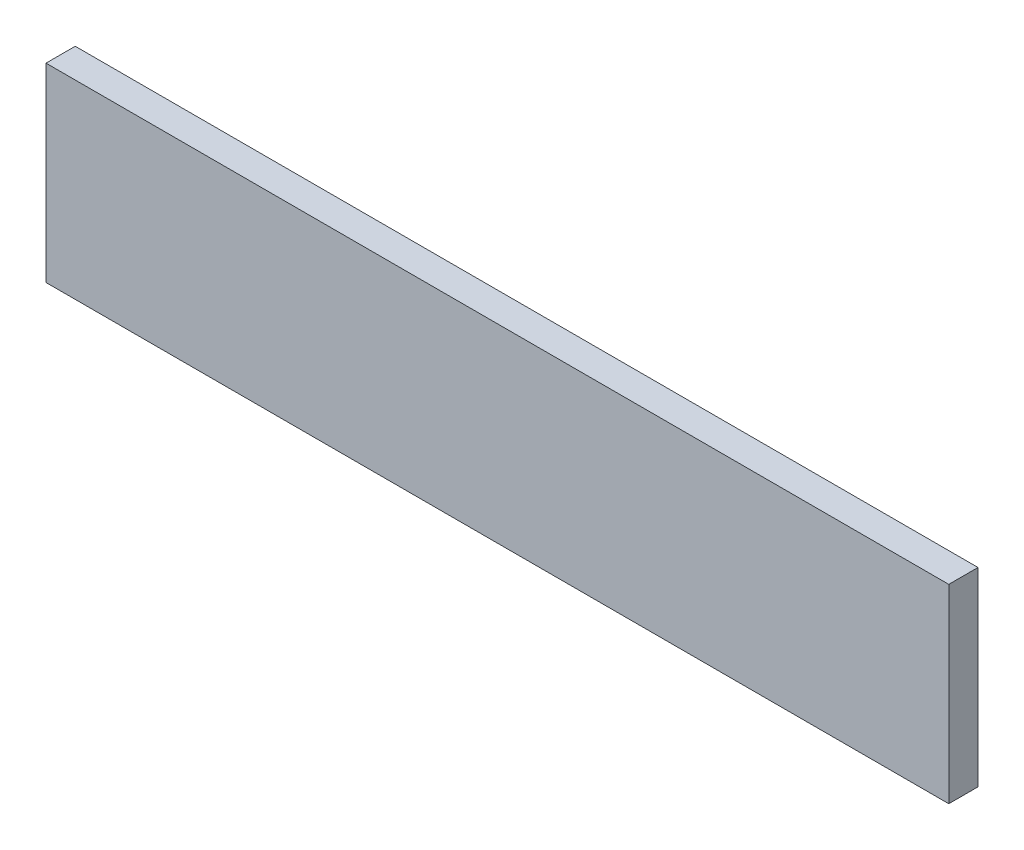
ISO-10303-21;
HEADER;
FILE_DESCRIPTION(('STEP AP214'),'2;1');
FILE_NAME('part.step','',(''),(''),'','','');
FILE_SCHEMA(('AUTOMOTIVE_DESIGN { 1 0 10303 214 1 1 1 1 }'));
ENDSEC;
DATA;
#1=APPLICATION_CONTEXT('core data for automotive mechanical design processes');
#2=APPLICATION_PROTOCOL_DEFINITION('international standard','automotive_design',2000,#1);
#3=PRODUCT_CONTEXT('',#1,'mechanical');
#4=PRODUCT('Part','Part','',(#3));
#5=PRODUCT_RELATED_PRODUCT_CATEGORY('part','',(#4));
#6=PRODUCT_DEFINITION_FORMATION('','',#4);
#7=PRODUCT_DEFINITION_CONTEXT('part definition',#1,'design');
#8=PRODUCT_DEFINITION('design','',#6,#7);
#9=PRODUCT_DEFINITION_SHAPE('','',#8);
#10=(LENGTH_UNIT() NAMED_UNIT(*) SI_UNIT(.MILLI.,.METRE.));
#11=(NAMED_UNIT(*) PLANE_ANGLE_UNIT() SI_UNIT($,.RADIAN.));
#12=(NAMED_UNIT(*) SI_UNIT($,.STERADIAN.) SOLID_ANGLE_UNIT());
#13=UNCERTAINTY_MEASURE_WITH_UNIT(LENGTH_MEASURE(1.E-05),#10,'distance_accuracy_value','');
#14=(GEOMETRIC_REPRESENTATION_CONTEXT(3) GLOBAL_UNCERTAINTY_ASSIGNED_CONTEXT((#13)) GLOBAL_UNIT_ASSIGNED_CONTEXT((#10,
#11,#12)) REPRESENTATION_CONTEXT('',''));
#15=CARTESIAN_POINT('',(0.,0.,0.));
#16=DIRECTION('',(0.,0.,1.));
#17=DIRECTION('',(1.,0.,0.));
#18=AXIS2_PLACEMENT_3D('',#15,#16,#17);
#19=CARTESIAN_POINT('',(196.1080533,41.275,12.7));
#20=DIRECTION('',(-1.,0.,0.));
#21=DIRECTION('',(0.,-1.,0.));
#22=AXIS2_PLACEMENT_3D('',#19,#20,#21);
#23=PLANE('',#22);
#24=DIRECTION('',(0.,1.,0.));
#25=VECTOR('',#24,1.);
#26=CARTESIAN_POINT('',(196.1080533,41.275,0.));
#27=LINE('',#26,#25);
#28=CARTESIAN_POINT('',(196.1080533,-41.275,0.));
#29=VERTEX_POINT('',#28);
#30=CARTESIAN_POINT('',(196.1080533,41.275,0.));
#31=VERTEX_POINT('',#30);
#32=EDGE_CURVE('E99',#29,#31,#27,.T.);
#33=ORIENTED_EDGE('',*,*,#32,.T.);
#34=DIRECTION('',(0.,0.,-1.));
#35=VECTOR('',#34,1.);
#36=CARTESIAN_POINT('',(196.1080533,41.275,12.7));
#37=LINE('',#36,#35);
#38=CARTESIAN_POINT('',(196.1080533,41.275,12.7));
#39=VERTEX_POINT('',#38);
#40=EDGE_CURVE('E11',#39,#31,#37,.T.);
#41=ORIENTED_EDGE('',*,*,#40,.F.);
#42=DIRECTION('',(0.,1.,0.));
#43=VECTOR('',#42,1.);
#44=CARTESIAN_POINT('',(196.1080533,41.275,12.7));
#45=LINE('',#44,#43);
#46=CARTESIAN_POINT('',(196.1080533,-41.275,12.7));
#47=VERTEX_POINT('',#46);
#48=EDGE_CURVE('E87',#47,#39,#45,.T.);
#49=ORIENTED_EDGE('',*,*,#48,.F.);
#50=DIRECTION('',(0.,0.,-1.));
#51=VECTOR('',#50,1.);
#52=CARTESIAN_POINT('',(196.1080533,-41.275,12.7));
#53=LINE('',#52,#51);
#54=EDGE_CURVE('E95',#47,#29,#53,.T.);
#55=ORIENTED_EDGE('',*,*,#54,.T.);
#56=EDGE_LOOP('',(#33,#41,#49,#55));
#57=FACE_BOUND('',#56,.T.);
#58=ADVANCED_FACE('F36',(#57),#23,.F.);
#59=CARTESIAN_POINT('',(-196.1080533,41.275,12.7));
#60=DIRECTION('',(0.,-1.,0.));
#61=DIRECTION('',(0.,0.,-1.));
#62=AXIS2_PLACEMENT_3D('',#59,#60,#61);
#63=PLANE('',#62);
#64=DIRECTION('',(-1.,0.,0.));
#65=VECTOR('',#64,1.);
#66=CARTESIAN_POINT('',(-196.1080533,41.275,0.));
#67=LINE('',#66,#65);
#68=CARTESIAN_POINT('',(-196.1080533,41.275,0.));
#69=VERTEX_POINT('',#68);
#70=EDGE_CURVE('E91',#31,#69,#67,.T.);
#71=ORIENTED_EDGE('',*,*,#70,.T.);
#72=DIRECTION('',(0.,0.,-1.));
#73=VECTOR('',#72,1.);
#74=CARTESIAN_POINT('',(-196.1080533,41.275,12.7));
#75=LINE('',#74,#73);
#76=CARTESIAN_POINT('',(-196.1080533,41.275,12.7));
#77=VERTEX_POINT('',#76);
#78=EDGE_CURVE('E44',#77,#69,#75,.T.);
#79=ORIENTED_EDGE('',*,*,#78,.F.);
#80=DIRECTION('',(-1.,0.,0.));
#81=VECTOR('',#80,1.);
#82=CARTESIAN_POINT('',(-196.1080533,41.275,12.7));
#83=LINE('',#82,#81);
#84=EDGE_CURVE('E82',#39,#77,#83,.T.);
#85=ORIENTED_EDGE('',*,*,#84,.F.);
#86=ORIENTED_EDGE('',*,*,#40,.T.);
#87=EDGE_LOOP('',(#71,#79,#85,#86));
#88=FACE_BOUND('',#87,.T.);
#89=ADVANCED_FACE('F90',(#88),#63,.F.);
#90=CARTESIAN_POINT('',(-196.1080533,41.275,12.7));
#91=DIRECTION('',(1.,0.,0.));
#92=DIRECTION('',(0.,0.,-1.));
#93=AXIS2_PLACEMENT_3D('',#90,#91,#92);
#94=PLANE('',#93);
#95=DIRECTION('',(0.,-1.,0.));
#96=VECTOR('',#95,1.);
#97=CARTESIAN_POINT('',(-196.1080533,41.275,0.));
#98=LINE('',#97,#96);
#99=CARTESIAN_POINT('',(-196.1080533,-41.275,0.));
#100=VERTEX_POINT('',#99);
#101=EDGE_CURVE('E69',#69,#100,#98,.T.);
#102=ORIENTED_EDGE('',*,*,#101,.T.);
#103=DIRECTION('',(0.,0.,-1.));
#104=VECTOR('',#103,1.);
#105=CARTESIAN_POINT('',(-196.1080533,-41.275,12.7));
#106=LINE('',#105,#104);
#107=CARTESIAN_POINT('',(-196.1080533,-41.275,12.7));
#108=VERTEX_POINT('',#107);
#109=EDGE_CURVE('E92',#108,#100,#106,.T.);
#110=ORIENTED_EDGE('',*,*,#109,.F.);
#111=DIRECTION('',(0.,-1.,0.));
#112=VECTOR('',#111,1.);
#113=CARTESIAN_POINT('',(-196.1080533,41.275,12.7));
#114=LINE('',#113,#112);
#115=EDGE_CURVE('E85',#77,#108,#114,.T.);
#116=ORIENTED_EDGE('',*,*,#115,.F.);
#117=ORIENTED_EDGE('',*,*,#78,.T.);
#118=EDGE_LOOP('',(#102,#110,#116,#117));
#119=FACE_BOUND('',#118,.T.);
#120=ADVANCED_FACE('F93',(#119),#94,.F.);
#121=CARTESIAN_POINT('',(-196.1080533,-41.275,12.7));
#122=DIRECTION('',(0.,1.,0.));
#123=DIRECTION('',(0.,0.,1.));
#124=AXIS2_PLACEMENT_3D('',#121,#122,#123);
#125=PLANE('',#124);
#126=DIRECTION('',(1.,0.,0.));
#127=VECTOR('',#126,1.);
#128=CARTESIAN_POINT('',(-196.1080533,-41.275,0.));
#129=LINE('',#128,#127);
#130=EDGE_CURVE('E75',#100,#29,#129,.T.);
#131=ORIENTED_EDGE('',*,*,#130,.T.);
#132=ORIENTED_EDGE('',*,*,#54,.F.);
#133=DIRECTION('',(1.,0.,0.));
#134=VECTOR('',#133,1.);
#135=CARTESIAN_POINT('',(-196.1080533,-41.275,12.7));
#136=LINE('',#135,#134);
#137=EDGE_CURVE('E52',#108,#47,#136,.T.);
#138=ORIENTED_EDGE('',*,*,#137,.F.);
#139=ORIENTED_EDGE('',*,*,#109,.T.);
#140=EDGE_LOOP('',(#131,#132,#138,#139));
#141=FACE_BOUND('',#140,.T.);
#142=ADVANCED_FACE('F106',(#141),#125,.F.);
#143=CARTESIAN_POINT('',(0.,0.,12.7));
#144=DIRECTION('',(0.,0.,1.));
#145=DIRECTION('',(1.,0.,0.));
#146=AXIS2_PLACEMENT_3D('',#143,#144,#145);
#147=PLANE('',#146);
#148=ORIENTED_EDGE('',*,*,#48,.T.);
#149=ORIENTED_EDGE('',*,*,#84,.T.);
#150=ORIENTED_EDGE('',*,*,#115,.T.);
#151=ORIENTED_EDGE('',*,*,#137,.T.);
#152=EDGE_LOOP('',(#148,#149,#150,#151));
#153=FACE_BOUND('',#152,.T.);
#154=ADVANCED_FACE('F83',(#153),#147,.T.);
#155=CARTESIAN_POINT('',(0.,0.,0.));
#156=DIRECTION('',(0.,0.,1.));
#157=DIRECTION('',(1.,0.,0.));
#158=AXIS2_PLACEMENT_3D('',#155,#156,#157);
#159=PLANE('',#158);
#160=ORIENTED_EDGE('',*,*,#32,.F.);
#161=ORIENTED_EDGE('',*,*,#130,.F.);
#162=ORIENTED_EDGE('',*,*,#101,.F.);
#163=ORIENTED_EDGE('',*,*,#70,.F.);
#164=EDGE_LOOP('',(#160,#161,#162,#163));
#165=FACE_BOUND('',#164,.T.);
#166=ADVANCED_FACE('F109',(#165),#159,.F.);
#167=CLOSED_SHELL('',(#58,#89,#120,#142,#154,#166));
#168=MANIFOLD_SOLID_BREP('B2',#167);
#169=ADVANCED_BREP_SHAPE_REPRESENTATION('',(#18,#168),#14);
#170=SHAPE_DEFINITION_REPRESENTATION(#9,#169);
ENDSEC;
END-ISO-10303-21;
